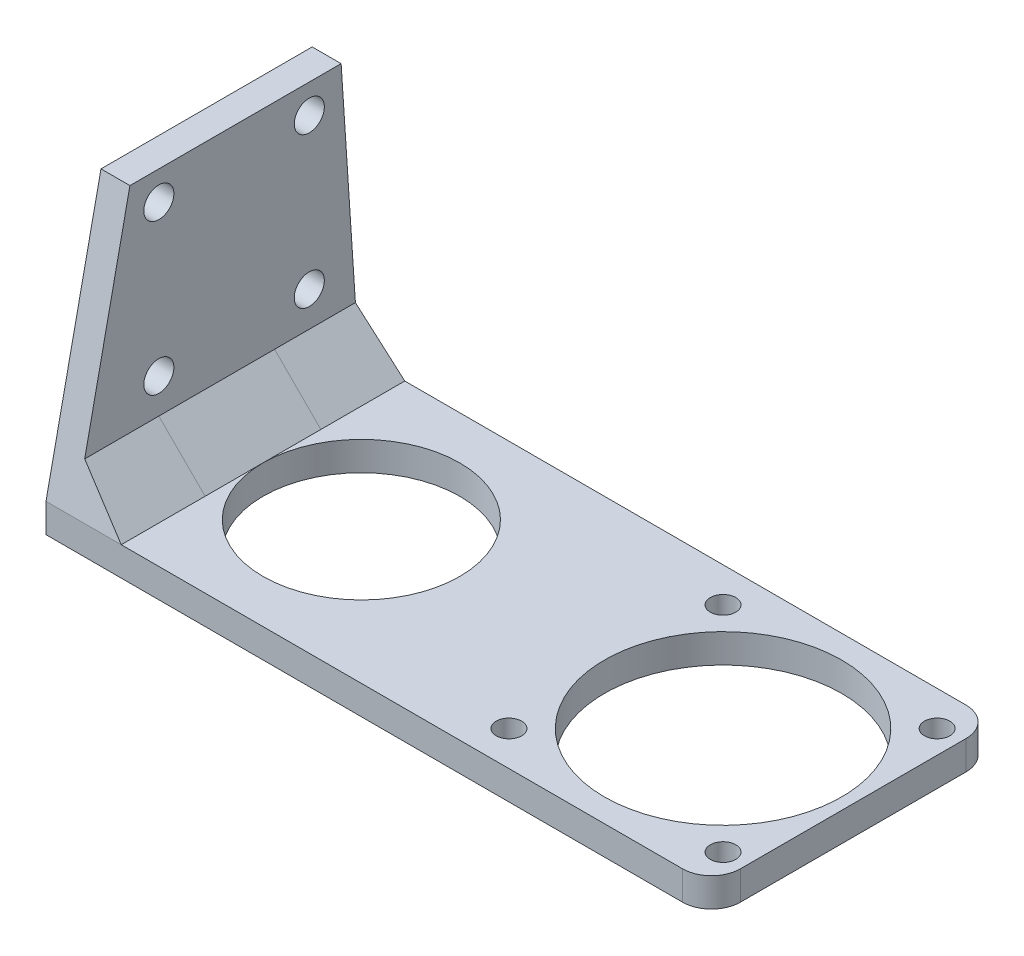
ISO-10303-21;
HEADER;
FILE_DESCRIPTION(('STEP AP214'),'2;1');
FILE_NAME('part.step','',(''),(''),'','','');
FILE_SCHEMA(('AUTOMOTIVE_DESIGN { 1 0 10303 214 1 1 1 1 }'));
ENDSEC;
DATA;
#1=APPLICATION_CONTEXT('core data for automotive mechanical design processes');
#2=APPLICATION_PROTOCOL_DEFINITION('international standard','automotive_design',2000,#1);
#3=PRODUCT_CONTEXT('',#1,'mechanical');
#4=PRODUCT('Part','Part','',(#3));
#5=PRODUCT_RELATED_PRODUCT_CATEGORY('part','',(#4));
#6=PRODUCT_DEFINITION_FORMATION('','',#4);
#7=PRODUCT_DEFINITION_CONTEXT('part definition',#1,'design');
#8=PRODUCT_DEFINITION('design','',#6,#7);
#9=PRODUCT_DEFINITION_SHAPE('','',#8);
#10=(LENGTH_UNIT() NAMED_UNIT(*) SI_UNIT(.MILLI.,.METRE.));
#11=(NAMED_UNIT(*) PLANE_ANGLE_UNIT() SI_UNIT($,.RADIAN.));
#12=(NAMED_UNIT(*) SI_UNIT($,.STERADIAN.) SOLID_ANGLE_UNIT());
#13=UNCERTAINTY_MEASURE_WITH_UNIT(LENGTH_MEASURE(1.E-05),#10,'distance_accuracy_value','');
#14=(GEOMETRIC_REPRESENTATION_CONTEXT(3) GLOBAL_UNCERTAINTY_ASSIGNED_CONTEXT((#13)) GLOBAL_UNIT_ASSIGNED_CONTEXT((#10,
#11,#12)) REPRESENTATION_CONTEXT('',''));
#15=CARTESIAN_POINT('',(0.,0.,0.));
#16=DIRECTION('',(0.,0.,1.));
#17=DIRECTION('',(1.,0.,0.));
#18=AXIS2_PLACEMENT_3D('',#15,#16,#17);
#19=CARTESIAN_POINT('',(-87.5,0.,0.));
#20=DIRECTION('',(-1.,0.,0.));
#21=DIRECTION('',(0.,0.,1.));
#22=AXIS2_PLACEMENT_3D('',#19,#20,#21);
#23=PLANE('',#22);
#24=CARTESIAN_POINT('',(-87.5,45.,-16.));
#25=DIRECTION('',(1.,0.,0.));
#26=DIRECTION('',(0.,0.,-1.));
#27=AXIS2_PLACEMENT_3D('',#24,#25,#26);
#28=CIRCLE('',#27,2.6);
#29=CARTESIAN_POINT('',(-87.5,45.,-18.6));
#30=VERTEX_POINT('',#29);
#31=EDGE_CURVE('E180',#30,#30,#28,.T.);
#32=ORIENTED_EDGE('',*,*,#31,.F.);
#33=EDGE_LOOP('',(#32));
#34=FACE_BOUND('',#33,.T.);
#35=CARTESIAN_POINT('',(-87.5,19.,-16.));
#36=DIRECTION('',(1.,0.,0.));
#37=DIRECTION('',(0.,0.,-1.));
#38=AXIS2_PLACEMENT_3D('',#35,#36,#37);
#39=CIRCLE('',#38,2.6);
#40=CARTESIAN_POINT('',(-87.5,19.,-18.6));
#41=VERTEX_POINT('',#40);
#42=EDGE_CURVE('E174',#41,#41,#39,.T.);
#43=ORIENTED_EDGE('',*,*,#42,.F.);
#44=EDGE_LOOP('',(#43));
#45=FACE_BOUND('',#44,.T.);
#46=CARTESIAN_POINT('',(-87.5,19.,9.99999999999999));
#47=DIRECTION('',(1.,0.,0.));
#48=DIRECTION('',(0.,0.,1.));
#49=AXIS2_PLACEMENT_3D('',#46,#47,#48);
#50=CIRCLE('',#49,2.59999999999999);
#51=CARTESIAN_POINT('',(-87.5,19.,12.6));
#52=VERTEX_POINT('',#51);
#53=EDGE_CURVE('E168',#52,#52,#50,.T.);
#54=ORIENTED_EDGE('',*,*,#53,.F.);
#55=EDGE_LOOP('',(#54));
#56=FACE_BOUND('',#55,.T.);
#57=CARTESIAN_POINT('',(-87.5,45.,10.));
#58=DIRECTION('',(1.,0.,0.));
#59=DIRECTION('',(0.,0.,1.));
#60=AXIS2_PLACEMENT_3D('',#57,#58,#59);
#61=CIRCLE('',#60,2.6);
#62=CARTESIAN_POINT('',(-87.5,45.,12.6));
#63=VERTEX_POINT('',#62);
#64=EDGE_CURVE('E162',#63,#63,#61,.T.);
#65=ORIENTED_EDGE('',*,*,#64,.F.);
#66=EDGE_LOOP('',(#65));
#67=FACE_BOUND('',#66,.T.);
#68=DIRECTION('',(0.,0.,-1.));
#69=VECTOR('',#68,1.);
#70=CARTESIAN_POINT('',(-87.5,13.,10.));
#71=LINE('',#70,#69);
#72=CARTESIAN_POINT('',(-87.5,13.,10.));
#73=VERTEX_POINT('',#72);
#74=CARTESIAN_POINT('',(-87.5,13.,-10.));
#75=VERTEX_POINT('',#74);
#76=EDGE_CURVE('E156',#73,#75,#71,.T.);
#77=ORIENTED_EDGE('',*,*,#76,.T.);
#78=DIRECTION('',(0.,0.,-1.));
#79=VECTOR('',#78,1.);
#80=CARTESIAN_POINT('',(-87.5,13.0000000000001,0.));
#81=LINE('',#80,#79);
#82=CARTESIAN_POINT('',(-87.5,13.0000000000001,-23.9666666666667));
#83=VERTEX_POINT('',#82);
#84=EDGE_CURVE('E153',#75,#83,#81,.T.);
#85=ORIENTED_EDGE('',*,*,#84,.T.);
#86=DIRECTION('',(0.,-0.997785157856609,-0.0665190105237733));
#87=VECTOR('',#86,1.);
#88=CARTESIAN_POINT('',(-87.5,5.,-24.5));
#89=LINE('',#88,#87);
#90=CARTESIAN_POINT('',(-87.5,50.,-21.5));
#91=VERTEX_POINT('',#90);
#92=EDGE_CURVE('E192',#91,#83,#89,.T.);
#93=ORIENTED_EDGE('',*,*,#92,.F.);
#94=DIRECTION('',(0.,0.,-1.));
#95=VECTOR('',#94,1.);
#96=CARTESIAN_POINT('',(-87.5,50.,-21.5));
#97=LINE('',#96,#95);
#98=CARTESIAN_POINT('',(-87.5,50.,15.));
#99=VERTEX_POINT('',#98);
#100=EDGE_CURVE('E188',#99,#91,#97,.T.);
#101=ORIENTED_EDGE('',*,*,#100,.F.);
#102=DIRECTION('',(0.,0.978434284203546,-0.206558348887415));
#103=VECTOR('',#102,1.);
#104=CARTESIAN_POINT('',(-87.5,50.,15.));
#105=LINE('',#104,#103);
#106=CARTESIAN_POINT('',(-87.5,13.0000000000001,22.8111111111111));
#107=VERTEX_POINT('',#106);
#108=EDGE_CURVE('E186',#107,#99,#105,.T.);
#109=ORIENTED_EDGE('',*,*,#108,.F.);
#110=DIRECTION('',(0.,0.,-1.));
#111=VECTOR('',#110,1.);
#112=CARTESIAN_POINT('',(-87.5,13.0000000000001,0.));
#113=LINE('',#112,#111);
#114=EDGE_CURVE('E214',#107,#73,#113,.T.);
#115=ORIENTED_EDGE('',*,*,#114,.T.);
#116=EDGE_LOOP('',(#77,#85,#93,#101,#109,#115));
#117=FACE_BOUND('',#116,.T.);
#118=ADVANCED_FACE('F33',(#34,#45,#56,#67,#117),#23,.F.);
#119=CARTESIAN_POINT('',(-87.5,5.,-24.5));
#120=DIRECTION('',(0.,0.,-1.));
#121=DIRECTION('',(-1.,0.,0.));
#122=AXIS2_PLACEMENT_3D('',#119,#120,#121);
#123=PLANE('',#122);
#124=DIRECTION('',(-1.,0.,0.));
#125=VECTOR('',#124,1.);
#126=CARTESIAN_POINT('',(22.5,5.,-24.5));
#127=LINE('',#126,#125);
#128=CARTESIAN_POINT('',(17.5,5.,-24.5));
#129=VERTEX_POINT('',#128);
#130=CARTESIAN_POINT('',(-79.5,5.,-24.5));
#131=VERTEX_POINT('',#130);
#132=EDGE_CURVE('E134',#129,#131,#127,.T.);
#133=ORIENTED_EDGE('',*,*,#132,.F.);
#134=DIRECTION('',(0.,-1.,0.));
#135=VECTOR('',#134,1.);
#136=CARTESIAN_POINT('',(17.5,0.,-24.5));
#137=LINE('',#136,#135);
#138=CARTESIAN_POINT('',(17.5,0.,-24.5));
#139=VERTEX_POINT('',#138);
#140=EDGE_CURVE('E233',#129,#139,#137,.T.);
#141=ORIENTED_EDGE('',*,*,#140,.T.);
#142=DIRECTION('',(-1.,0.,0.));
#143=VECTOR('',#142,1.);
#144=CARTESIAN_POINT('',(-87.5,0.,-24.5));
#145=LINE('',#144,#143);
#146=CARTESIAN_POINT('',(-92.5,0.,-24.5));
#147=VERTEX_POINT('',#146);
#148=EDGE_CURVE('E195',#139,#147,#145,.T.);
#149=ORIENTED_EDGE('',*,*,#148,.T.);
#150=DIRECTION('',(0.,-1.,0.));
#151=VECTOR('',#150,1.);
#152=CARTESIAN_POINT('',(-92.5,5.,-24.5));
#153=LINE('',#152,#151);
#154=CARTESIAN_POINT('',(-92.5,5.,-24.5));
#155=VERTEX_POINT('',#154);
#156=EDGE_CURVE('E183',#155,#147,#153,.T.);
#157=ORIENTED_EDGE('',*,*,#156,.F.);
#158=DIRECTION('',(-1.,0.,0.));
#159=VECTOR('',#158,1.);
#160=CARTESIAN_POINT('',(-87.5,5.,-24.5));
#161=LINE('',#160,#159);
#162=EDGE_CURVE('E212',#131,#155,#161,.T.);
#163=ORIENTED_EDGE('',*,*,#162,.F.);
#164=EDGE_LOOP('',(#133,#141,#149,#157,#163));
#165=FACE_BOUND('',#164,.T.);
#166=ADVANCED_FACE('F249',(#165),#123,.T.);
#167=CARTESIAN_POINT('',(-87.5,5.,-24.5));
#168=DIRECTION('',(0.,0.0665190105237733,-0.997785157856609));
#169=DIRECTION('',(0.,0.997785157856609,0.0665190105237733));
#170=AXIS2_PLACEMENT_3D('',#167,#168,#169);
#171=PLANE('',#170);
#172=DIRECTION('',(0.,-0.997785157856609,-0.0665190105237733));
#173=VECTOR('',#172,1.);
#174=CARTESIAN_POINT('',(-92.5,5.,-24.5));
#175=LINE('',#174,#173);
#176=CARTESIAN_POINT('',(-92.5,50.,-21.5));
#177=VERTEX_POINT('',#176);
#178=EDGE_CURVE('E189',#177,#155,#175,.T.);
#179=ORIENTED_EDGE('',*,*,#178,.F.);
#180=DIRECTION('',(-1.,0.,0.));
#181=VECTOR('',#180,1.);
#182=CARTESIAN_POINT('',(-87.5,50.,-21.5));
#183=LINE('',#182,#181);
#184=EDGE_CURVE('E215',#91,#177,#183,.T.);
#185=ORIENTED_EDGE('',*,*,#184,.F.);
#186=ORIENTED_EDGE('',*,*,#92,.T.);
#187=DIRECTION('',(0.706322414022014,-0.70632241402202,-0.0470881609348009));
#188=VECTOR('',#187,1.);
#189=CARTESIAN_POINT('',(-88.2971175166297,13.7971175166298,-23.9135254988913));
#190=LINE('',#189,#188);
#191=EDGE_CURVE('E138',#83,#131,#190,.T.);
#192=ORIENTED_EDGE('',*,*,#191,.T.);
#193=ORIENTED_EDGE('',*,*,#162,.T.);
#194=EDGE_LOOP('',(#179,#185,#186,#192,#193));
#195=FACE_BOUND('',#194,.T.);
#196=ADVANCED_FACE('F325',(#195),#171,.T.);
#197=CARTESIAN_POINT('',(-87.5,50.,-21.5));
#198=DIRECTION('',(0.,1.,0.));
#199=DIRECTION('',(0.,0.,1.));
#200=AXIS2_PLACEMENT_3D('',#197,#198,#199);
#201=PLANE('',#200);
#202=DIRECTION('',(0.,0.,-1.));
#203=VECTOR('',#202,1.);
#204=CARTESIAN_POINT('',(-92.5,50.,-21.5));
#205=LINE('',#204,#203);
#206=CARTESIAN_POINT('',(-92.5,50.,15.));
#207=VERTEX_POINT('',#206);
#208=EDGE_CURVE('E207',#207,#177,#205,.T.);
#209=ORIENTED_EDGE('',*,*,#208,.F.);
#210=DIRECTION('',(-1.,0.,0.));
#211=VECTOR('',#210,1.);
#212=CARTESIAN_POINT('',(-87.5,50.,15.));
#213=LINE('',#212,#211);
#214=EDGE_CURVE('E217',#99,#207,#213,.T.);
#215=ORIENTED_EDGE('',*,*,#214,.F.);
#216=ORIENTED_EDGE('',*,*,#100,.T.);
#217=ORIENTED_EDGE('',*,*,#184,.T.);
#218=EDGE_LOOP('',(#209,#215,#216,#217));
#219=FACE_BOUND('',#218,.T.);
#220=ADVANCED_FACE('F339',(#219),#201,.T.);
#221=CARTESIAN_POINT('',(-87.5,50.,15.));
#222=DIRECTION('',(0.,0.206558348887415,0.978434284203546));
#223=DIRECTION('',(0.,-0.978434284203546,0.206558348887415));
#224=AXIS2_PLACEMENT_3D('',#221,#222,#223);
#225=PLANE('',#224);
#226=DIRECTION('',(0.,0.978434284203546,-0.206558348887415));
#227=VECTOR('',#226,1.);
#228=CARTESIAN_POINT('',(-92.5,50.,15.));
#229=LINE('',#228,#227);
#230=CARTESIAN_POINT('',(-92.5,5.,24.5));
#231=VERTEX_POINT('',#230);
#232=EDGE_CURVE('E204',#231,#207,#229,.T.);
#233=ORIENTED_EDGE('',*,*,#232,.F.);
#234=DIRECTION('',(-1.,0.,0.));
#235=VECTOR('',#234,1.);
#236=CARTESIAN_POINT('',(-87.5,5.,24.5));
#237=LINE('',#236,#235);
#238=CARTESIAN_POINT('',(-79.5,5.,24.5));
#239=VERTEX_POINT('',#238);
#240=EDGE_CURVE('E219',#239,#231,#237,.T.);
#241=ORIENTED_EDGE('',*,*,#240,.F.);
#242=DIRECTION('',(-0.699357490632738,0.699357490632744,-0.147642136911357));
#243=VECTOR('',#242,1.);
#244=CARTESIAN_POINT('',(-89.8553529376245,15.3553529376246,22.3138699353903));
#245=LINE('',#244,#243);
#246=EDGE_CURVE('E231',#239,#107,#245,.T.);
#247=ORIENTED_EDGE('',*,*,#246,.T.);
#248=ORIENTED_EDGE('',*,*,#108,.T.);
#249=ORIENTED_EDGE('',*,*,#214,.T.);
#250=EDGE_LOOP('',(#233,#241,#247,#248,#249));
#251=FACE_BOUND('',#250,.T.);
#252=ADVANCED_FACE('F343',(#251),#225,.T.);
#253=CARTESIAN_POINT('',(-87.5,0.,24.5));
#254=DIRECTION('',(0.,0.,1.));
#255=DIRECTION('',(1.,0.,0.));
#256=AXIS2_PLACEMENT_3D('',#253,#254,#255);
#257=PLANE('',#256);
#258=DIRECTION('',(-1.,0.,0.));
#259=VECTOR('',#258,1.);
#260=CARTESIAN_POINT('',(-87.5,0.,24.5));
#261=LINE('',#260,#259);
#262=CARTESIAN_POINT('',(17.5,0.,24.5));
#263=VERTEX_POINT('',#262);
#264=CARTESIAN_POINT('',(-92.5,0.,24.5));
#265=VERTEX_POINT('',#264);
#266=EDGE_CURVE('E221',#263,#265,#261,.T.);
#267=ORIENTED_EDGE('',*,*,#266,.F.);
#268=DIRECTION('',(0.,-1.,0.));
#269=VECTOR('',#268,1.);
#270=CARTESIAN_POINT('',(17.5,5.,24.5));
#271=LINE('',#270,#269);
#272=CARTESIAN_POINT('',(17.5,5.,24.5));
#273=VERTEX_POINT('',#272);
#274=EDGE_CURVE('E11',#263,#273,#271,.F.);
#275=ORIENTED_EDGE('',*,*,#274,.T.);
#276=DIRECTION('',(1.,0.,0.));
#277=VECTOR('',#276,1.);
#278=CARTESIAN_POINT('',(-92.5,5.,24.5));
#279=LINE('',#278,#277);
#280=EDGE_CURVE('E252',#239,#273,#279,.T.);
#281=ORIENTED_EDGE('',*,*,#280,.F.);
#282=ORIENTED_EDGE('',*,*,#240,.T.);
#283=DIRECTION('',(0.,1.,0.));
#284=VECTOR('',#283,1.);
#285=CARTESIAN_POINT('',(-92.5,0.,24.5));
#286=LINE('',#285,#284);
#287=EDGE_CURVE('E201',#265,#231,#286,.T.);
#288=ORIENTED_EDGE('',*,*,#287,.F.);
#289=EDGE_LOOP('',(#267,#275,#281,#282,#288));
#290=FACE_BOUND('',#289,.T.);
#291=ADVANCED_FACE('F347',(#290),#257,.T.);
#292=CARTESIAN_POINT('',(-87.5,0.,-24.5));
#293=DIRECTION('',(0.,-1.,0.));
#294=DIRECTION('',(0.,0.,-1.));
#295=AXIS2_PLACEMENT_3D('',#292,#293,#294);
#296=PLANE('',#295);
#297=ORIENTED_EDGE('',*,*,#148,.F.);
#298=CARTESIAN_POINT('',(17.5,0.,-19.5));
#299=DIRECTION('',(0.,-1.,0.));
#300=DIRECTION('',(0.,0.,-1.));
#301=AXIS2_PLACEMENT_3D('',#298,#299,#300);
#302=CIRCLE('',#301,5.);
#303=CARTESIAN_POINT('',(22.5,0.,-19.5));
#304=VERTEX_POINT('',#303);
#305=EDGE_CURVE('E238',#139,#304,#302,.T.);
#306=ORIENTED_EDGE('',*,*,#305,.T.);
#307=DIRECTION('',(0.,0.,-1.));
#308=VECTOR('',#307,1.);
#309=CARTESIAN_POINT('',(22.5,0.,-22.5));
#310=LINE('',#309,#308);
#311=CARTESIAN_POINT('',(22.5,0.,19.5));
#312=VERTEX_POINT('',#311);
#313=EDGE_CURVE('E260',#312,#304,#310,.T.);
#314=ORIENTED_EDGE('',*,*,#313,.F.);
#315=CARTESIAN_POINT('',(17.5,0.,19.5));
#316=DIRECTION('',(0.,-1.,0.));
#317=DIRECTION('',(0.,0.,-1.));
#318=AXIS2_PLACEMENT_3D('',#315,#316,#317);
#319=CIRCLE('',#318,5.);
#320=EDGE_CURVE('E236',#312,#263,#319,.T.);
#321=ORIENTED_EDGE('',*,*,#320,.T.);
#322=ORIENTED_EDGE('',*,*,#266,.T.);
#323=DIRECTION('',(0.,0.,1.));
#324=VECTOR('',#323,1.);
#325=CARTESIAN_POINT('',(-92.5,0.,-24.5));
#326=LINE('',#325,#324);
#327=EDGE_CURVE('E198',#147,#265,#326,.T.);
#328=ORIENTED_EDGE('',*,*,#327,.F.);
#329=EDGE_LOOP('',(#297,#306,#314,#321,#322,#328));
#330=FACE_BOUND('',#329,.T.);
#331=CARTESIAN_POINT('',(-62.5,0.,0.));
#332=DIRECTION('',(0.,1.,0.));
#333=DIRECTION('',(0.,0.,1.));
#334=AXIS2_PLACEMENT_3D('',#331,#332,#333);
#335=CIRCLE('',#334,17.);
#336=CARTESIAN_POINT('',(-62.5,0.,17.));
#337=VERTEX_POINT('',#336);
#338=EDGE_CURVE('E299',#337,#337,#335,.T.);
#339=ORIENTED_EDGE('',*,*,#338,.T.);
#340=EDGE_LOOP('',(#339));
#341=FACE_BOUND('',#340,.T.);
#342=CARTESIAN_POINT('',(-18.5,0.,18.5));
#343=DIRECTION('',(0.,1.,0.));
#344=DIRECTION('',(0.,0.,-1.));
#345=AXIS2_PLACEMENT_3D('',#342,#343,#344);
#346=CIRCLE('',#345,2.2);
#347=CARTESIAN_POINT('',(-18.5,0.,16.3));
#348=VERTEX_POINT('',#347);
#349=EDGE_CURVE('E294',#348,#348,#346,.T.);
#350=ORIENTED_EDGE('',*,*,#349,.T.);
#351=EDGE_LOOP('',(#350));
#352=FACE_BOUND('',#351,.T.);
#353=CARTESIAN_POINT('',(18.5,0.,18.5));
#354=DIRECTION('',(0.,1.,0.));
#355=DIRECTION('',(0.,0.,1.));
#356=AXIS2_PLACEMENT_3D('',#353,#354,#355);
#357=CIRCLE('',#356,2.2);
#358=CARTESIAN_POINT('',(18.5,0.,20.7));
#359=VERTEX_POINT('',#358);
#360=EDGE_CURVE('E288',#359,#359,#357,.T.);
#361=ORIENTED_EDGE('',*,*,#360,.T.);
#362=EDGE_LOOP('',(#361));
#363=FACE_BOUND('',#362,.T.);
#364=CARTESIAN_POINT('',(-18.5,0.,-18.5));
#365=DIRECTION('',(0.,1.,0.));
#366=DIRECTION('',(0.,0.,1.));
#367=AXIS2_PLACEMENT_3D('',#364,#365,#366);
#368=CIRCLE('',#367,2.2);
#369=CARTESIAN_POINT('',(-18.5,0.,-16.3));
#370=VERTEX_POINT('',#369);
#371=EDGE_CURVE('E282',#370,#370,#368,.T.);
#372=ORIENTED_EDGE('',*,*,#371,.T.);
#373=EDGE_LOOP('',(#372));
#374=FACE_BOUND('',#373,.T.);
#375=CARTESIAN_POINT('',(18.5,0.,-18.5));
#376=DIRECTION('',(0.,1.,0.));
#377=DIRECTION('',(0.,0.,-1.));
#378=AXIS2_PLACEMENT_3D('',#375,#376,#377);
#379=CIRCLE('',#378,2.2);
#380=CARTESIAN_POINT('',(18.5,0.,-20.7));
#381=VERTEX_POINT('',#380);
#382=EDGE_CURVE('E276',#381,#381,#379,.T.);
#383=ORIENTED_EDGE('',*,*,#382,.T.);
#384=EDGE_LOOP('',(#383));
#385=FACE_BOUND('',#384,.T.);
#386=CARTESIAN_POINT('',(0.,0.,0.));
#387=DIRECTION('',(0.,1.,0.));
#388=DIRECTION('',(0.,0.,1.));
#389=AXIS2_PLACEMENT_3D('',#386,#387,#388);
#390=CIRCLE('',#389,20.5);
#391=CARTESIAN_POINT('',(0.,0.,20.5));
#392=VERTEX_POINT('',#391);
#393=EDGE_CURVE('E268',#392,#392,#390,.T.);
#394=ORIENTED_EDGE('',*,*,#393,.T.);
#395=EDGE_LOOP('',(#394));
#396=FACE_BOUND('',#395,.T.);
#397=ADVANCED_FACE('F258',(#330,#341,#352,#363,#374,#385,#396),#296,.T.);
#398=CARTESIAN_POINT('',(-92.5,0.,0.));
#399=DIRECTION('',(-1.,0.,0.));
#400=DIRECTION('',(0.,0.,1.));
#401=AXIS2_PLACEMENT_3D('',#398,#399,#400);
#402=PLANE('',#401);
#403=ORIENTED_EDGE('',*,*,#178,.T.);
#404=ORIENTED_EDGE('',*,*,#156,.T.);
#405=ORIENTED_EDGE('',*,*,#327,.T.);
#406=ORIENTED_EDGE('',*,*,#287,.T.);
#407=ORIENTED_EDGE('',*,*,#232,.T.);
#408=ORIENTED_EDGE('',*,*,#208,.T.);
#409=EDGE_LOOP('',(#403,#404,#405,#406,#407,#408));
#410=FACE_BOUND('',#409,.T.);
#411=CARTESIAN_POINT('',(-92.5,45.,10.));
#412=DIRECTION('',(-1.,0.,0.));
#413=DIRECTION('',(0.,0.,1.));
#414=AXIS2_PLACEMENT_3D('',#411,#412,#413);
#415=CIRCLE('',#414,2.6);
#416=CARTESIAN_POINT('',(-92.5,45.,12.6));
#417=VERTEX_POINT('',#416);
#418=EDGE_CURVE('E161',#417,#417,#415,.F.);
#419=ORIENTED_EDGE('',*,*,#418,.T.);
#420=EDGE_LOOP('',(#419));
#421=FACE_BOUND('',#420,.T.);
#422=CARTESIAN_POINT('',(-92.5,19.,9.99999999999999));
#423=DIRECTION('',(-1.,0.,0.));
#424=DIRECTION('',(0.,0.,1.));
#425=AXIS2_PLACEMENT_3D('',#422,#423,#424);
#426=CIRCLE('',#425,2.59999999999999);
#427=CARTESIAN_POINT('',(-92.5,19.,12.6));
#428=VERTEX_POINT('',#427);
#429=EDGE_CURVE('E165',#428,#428,#426,.F.);
#430=ORIENTED_EDGE('',*,*,#429,.T.);
#431=EDGE_LOOP('',(#430));
#432=FACE_BOUND('',#431,.T.);
#433=CARTESIAN_POINT('',(-92.5,19.,-16.));
#434=DIRECTION('',(-1.,0.,0.));
#435=DIRECTION('',(0.,0.,1.));
#436=AXIS2_PLACEMENT_3D('',#433,#434,#435);
#437=CIRCLE('',#436,2.6);
#438=CARTESIAN_POINT('',(-92.5,19.,-13.4));
#439=VERTEX_POINT('',#438);
#440=EDGE_CURVE('E171',#439,#439,#437,.F.);
#441=ORIENTED_EDGE('',*,*,#440,.T.);
#442=EDGE_LOOP('',(#441));
#443=FACE_BOUND('',#442,.T.);
#444=CARTESIAN_POINT('',(-92.5,45.,-16.));
#445=DIRECTION('',(-1.,0.,0.));
#446=DIRECTION('',(0.,0.,1.));
#447=AXIS2_PLACEMENT_3D('',#444,#445,#446);
#448=CIRCLE('',#447,2.6);
#449=CARTESIAN_POINT('',(-92.5,45.,-13.4));
#450=VERTEX_POINT('',#449);
#451=EDGE_CURVE('E177',#450,#450,#448,.F.);
#452=ORIENTED_EDGE('',*,*,#451,.T.);
#453=EDGE_LOOP('',(#452));
#454=FACE_BOUND('',#453,.T.);
#455=ADVANCED_FACE('F333',(#410,#421,#432,#443,#454),#402,.T.);
#456=CARTESIAN_POINT('',(-92.501,45.,-16.));
#457=DIRECTION('',(1.,0.,0.));
#458=DIRECTION('',(0.,0.,-1.));
#459=AXIS2_PLACEMENT_3D('',#456,#457,#458);
#460=CYLINDRICAL_SURFACE('',#459,2.6);
#461=ORIENTED_EDGE('',*,*,#451,.F.);
#462=EDGE_LOOP('',(#461));
#463=FACE_BOUND('',#462,.T.);
#464=ORIENTED_EDGE('',*,*,#31,.T.);
#465=EDGE_LOOP('',(#464));
#466=FACE_BOUND('',#465,.T.);
#467=ADVANCED_FACE('F331',(#463,#466),#460,.F.);
#468=CARTESIAN_POINT('',(-92.501,19.,-16.));
#469=DIRECTION('',(1.,0.,0.));
#470=DIRECTION('',(0.,0.,-1.));
#471=AXIS2_PLACEMENT_3D('',#468,#469,#470);
#472=CYLINDRICAL_SURFACE('',#471,2.6);
#473=ORIENTED_EDGE('',*,*,#440,.F.);
#474=EDGE_LOOP('',(#473));
#475=FACE_BOUND('',#474,.T.);
#476=ORIENTED_EDGE('',*,*,#42,.T.);
#477=EDGE_LOOP('',(#476));
#478=FACE_BOUND('',#477,.T.);
#479=ADVANCED_FACE('F386',(#475,#478),#472,.F.);
#480=CARTESIAN_POINT('',(-92.501,19.,9.99999999999999));
#481=DIRECTION('',(1.,0.,0.));
#482=DIRECTION('',(0.,0.,-1.));
#483=AXIS2_PLACEMENT_3D('',#480,#481,#482);
#484=CYLINDRICAL_SURFACE('',#483,2.59999999999999);
#485=ORIENTED_EDGE('',*,*,#429,.F.);
#486=EDGE_LOOP('',(#485));
#487=FACE_BOUND('',#486,.T.);
#488=ORIENTED_EDGE('',*,*,#53,.T.);
#489=EDGE_LOOP('',(#488));
#490=FACE_BOUND('',#489,.T.);
#491=ADVANCED_FACE('F390',(#487,#490),#484,.F.);
#492=CARTESIAN_POINT('',(-92.501,45.,10.));
#493=DIRECTION('',(1.,0.,0.));
#494=DIRECTION('',(0.,0.,-1.));
#495=AXIS2_PLACEMENT_3D('',#492,#493,#494);
#496=CYLINDRICAL_SURFACE('',#495,2.6);
#497=ORIENTED_EDGE('',*,*,#418,.F.);
#498=EDGE_LOOP('',(#497));
#499=FACE_BOUND('',#498,.T.);
#500=ORIENTED_EDGE('',*,*,#64,.T.);
#501=EDGE_LOOP('',(#500));
#502=FACE_BOUND('',#501,.T.);
#503=ADVANCED_FACE('F395',(#499,#502),#496,.F.);
#504=CARTESIAN_POINT('',(-87.5,13.,10.));
#505=DIRECTION('',(-0.707106781186547,-0.707106781186548,0.));
#506=DIRECTION('',(0.707106781186548,-0.707106781186547,0.));
#507=AXIS2_PLACEMENT_3D('',#504,#505,#506);
#508=PLANE('',#507);
#509=DIRECTION('',(-0.707106781186548,0.707106781186547,0.));
#510=VECTOR('',#509,1.);
#511=CARTESIAN_POINT('',(-87.5,13.,-10.));
#512=LINE('',#511,#510);
#513=CARTESIAN_POINT('',(-79.5,5.,-10.));
#514=VERTEX_POINT('',#513);
#515=EDGE_CURVE('E144',#514,#75,#512,.T.);
#516=ORIENTED_EDGE('',*,*,#515,.T.);
#517=ORIENTED_EDGE('',*,*,#76,.F.);
#518=DIRECTION('',(-0.707106781186548,0.707106781186547,0.));
#519=VECTOR('',#518,1.);
#520=CARTESIAN_POINT('',(-87.5,13.,10.));
#521=LINE('',#520,#519);
#522=CARTESIAN_POINT('',(-79.5,5.,10.));
#523=VERTEX_POINT('',#522);
#524=EDGE_CURVE('E154',#523,#73,#521,.T.);
#525=ORIENTED_EDGE('',*,*,#524,.F.);
#526=DIRECTION('',(0.,0.,-1.));
#527=VECTOR('',#526,1.);
#528=CARTESIAN_POINT('',(-79.5,5.,10.));
#529=LINE('',#528,#527);
#530=CARTESIAN_POINT('',(-79.5,5.00000000000001,0.));
#531=VERTEX_POINT('',#530);
#532=EDGE_CURVE('E147',#523,#531,#529,.T.);
#533=ORIENTED_EDGE('',*,*,#532,.T.);
#534=DIRECTION('',(0.,0.,-1.));
#535=VECTOR('',#534,1.);
#536=CARTESIAN_POINT('',(-79.5,5.,10.));
#537=LINE('',#536,#535);
#538=EDGE_CURVE('E131',#531,#514,#537,.T.);
#539=ORIENTED_EDGE('',*,*,#538,.T.);
#540=EDGE_LOOP('',(#516,#517,#525,#533,#539));
#541=FACE_BOUND('',#540,.T.);
#542=ADVANCED_FACE('F142',(#541),#508,.F.);
#543=CARTESIAN_POINT('',(0.,5.,0.));
#544=DIRECTION('',(0.,1.,0.));
#545=DIRECTION('',(0.,0.,1.));
#546=AXIS2_PLACEMENT_3D('',#543,#544,#545);
#547=PLANE('',#546);
#548=CARTESIAN_POINT('',(0.,5.,0.));
#549=DIRECTION('',(0.,1.,0.));
#550=DIRECTION('',(0.,0.,1.));
#551=AXIS2_PLACEMENT_3D('',#548,#549,#550);
#552=CIRCLE('',#551,20.5);
#553=CARTESIAN_POINT('',(0.,5.,20.5));
#554=VERTEX_POINT('',#553);
#555=EDGE_CURVE('E264',#554,#554,#552,.T.);
#556=ORIENTED_EDGE('',*,*,#555,.F.);
#557=EDGE_LOOP('',(#556));
#558=FACE_BOUND('',#557,.T.);
#559=CARTESIAN_POINT('',(18.5,5.,-18.5));
#560=DIRECTION('',(0.,1.,0.));
#561=DIRECTION('',(0.,0.,1.));
#562=AXIS2_PLACEMENT_3D('',#559,#560,#561);
#563=CIRCLE('',#562,2.2);
#564=CARTESIAN_POINT('',(18.5,5.,-16.3));
#565=VERTEX_POINT('',#564);
#566=EDGE_CURVE('E272',#565,#565,#563,.T.);
#567=ORIENTED_EDGE('',*,*,#566,.F.);
#568=EDGE_LOOP('',(#567));
#569=FACE_BOUND('',#568,.T.);
#570=CARTESIAN_POINT('',(-18.5,5.,-18.5));
#571=DIRECTION('',(0.,1.,0.));
#572=DIRECTION('',(0.,0.,1.));
#573=AXIS2_PLACEMENT_3D('',#570,#571,#572);
#574=CIRCLE('',#573,2.2);
#575=CARTESIAN_POINT('',(-18.5,5.,-16.3));
#576=VERTEX_POINT('',#575);
#577=EDGE_CURVE('E279',#576,#576,#574,.T.);
#578=ORIENTED_EDGE('',*,*,#577,.F.);
#579=EDGE_LOOP('',(#578));
#580=FACE_BOUND('',#579,.T.);
#581=CARTESIAN_POINT('',(18.5,5.,18.5));
#582=DIRECTION('',(0.,1.,0.));
#583=DIRECTION('',(0.,0.,1.));
#584=AXIS2_PLACEMENT_3D('',#581,#582,#583);
#585=CIRCLE('',#584,2.2);
#586=CARTESIAN_POINT('',(18.5,5.,20.7));
#587=VERTEX_POINT('',#586);
#588=EDGE_CURVE('E285',#587,#587,#585,.T.);
#589=ORIENTED_EDGE('',*,*,#588,.F.);
#590=EDGE_LOOP('',(#589));
#591=FACE_BOUND('',#590,.T.);
#592=CARTESIAN_POINT('',(-18.5,5.,18.5));
#593=DIRECTION('',(0.,1.,0.));
#594=DIRECTION('',(0.,0.,1.));
#595=AXIS2_PLACEMENT_3D('',#592,#593,#594);
#596=CIRCLE('',#595,2.2);
#597=CARTESIAN_POINT('',(-18.5,5.,20.7));
#598=VERTEX_POINT('',#597);
#599=EDGE_CURVE('E291',#598,#598,#596,.T.);
#600=ORIENTED_EDGE('',*,*,#599,.F.);
#601=EDGE_LOOP('',(#600));
#602=FACE_BOUND('',#601,.T.);
#603=DIRECTION('',(0.,0.,-1.));
#604=VECTOR('',#603,1.);
#605=CARTESIAN_POINT('',(22.5,5.,-22.5));
#606=LINE('',#605,#604);
#607=CARTESIAN_POINT('',(22.5,5.,19.5));
#608=VERTEX_POINT('',#607);
#609=CARTESIAN_POINT('',(22.5,5.,-19.5));
#610=VERTEX_POINT('',#609);
#611=EDGE_CURVE('E148',#608,#610,#606,.T.);
#612=ORIENTED_EDGE('',*,*,#611,.T.);
#613=CARTESIAN_POINT('',(17.5,5.,-19.5));
#614=DIRECTION('',(0.,1.,0.));
#615=DIRECTION('',(0.,0.,1.));
#616=AXIS2_PLACEMENT_3D('',#613,#614,#615);
#617=CIRCLE('',#616,5.);
#618=EDGE_CURVE('E41',#610,#129,#617,.T.);
#619=ORIENTED_EDGE('',*,*,#618,.T.);
#620=ORIENTED_EDGE('',*,*,#132,.T.);
#621=DIRECTION('',(0.,0.,1.));
#622=VECTOR('',#621,1.);
#623=CARTESIAN_POINT('',(-79.5,5.,0.));
#624=LINE('',#623,#622);
#625=EDGE_CURVE('E127',#131,#514,#624,.T.);
#626=ORIENTED_EDGE('',*,*,#625,.T.);
#627=ORIENTED_EDGE('',*,*,#538,.F.);
#628=CARTESIAN_POINT('',(-62.5,5.,0.));
#629=DIRECTION('',(0.,1.,0.));
#630=DIRECTION('',(0.,0.,1.));
#631=AXIS2_PLACEMENT_3D('',#628,#629,#630);
#632=CIRCLE('',#631,17.);
#633=EDGE_CURVE('E253',#531,#531,#632,.T.);
#634=ORIENTED_EDGE('',*,*,#633,.F.);
#635=ORIENTED_EDGE('',*,*,#532,.F.);
#636=DIRECTION('',(0.,0.,1.));
#637=VECTOR('',#636,1.);
#638=CARTESIAN_POINT('',(-79.5,5.,0.));
#639=LINE('',#638,#637);
#640=EDGE_CURVE('E139',#523,#239,#639,.T.);
#641=ORIENTED_EDGE('',*,*,#640,.T.);
#642=ORIENTED_EDGE('',*,*,#280,.T.);
#643=CARTESIAN_POINT('',(17.5,5.,19.5));
#644=DIRECTION('',(0.,1.,0.));
#645=DIRECTION('',(0.,0.,1.));
#646=AXIS2_PLACEMENT_3D('',#643,#644,#645);
#647=CIRCLE('',#646,5.);
#648=EDGE_CURVE('E244',#273,#608,#647,.T.);
#649=ORIENTED_EDGE('',*,*,#648,.T.);
#650=EDGE_LOOP('',(#612,#619,#620,#626,#627,#634,#635,#641,#642,#649));
#651=FACE_BOUND('',#650,.T.);
#652=ADVANCED_FACE('F129',(#558,#569,#580,#591,#602,#651),#547,.T.);
#653=CARTESIAN_POINT('',(22.5,5.,-22.5));
#654=DIRECTION('',(-1.,0.,0.));
#655=DIRECTION('',(0.,0.,1.));
#656=AXIS2_PLACEMENT_3D('',#653,#654,#655);
#657=PLANE('',#656);
#658=ORIENTED_EDGE('',*,*,#313,.T.);
#659=DIRECTION('',(0.,-1.,0.));
#660=VECTOR('',#659,1.);
#661=CARTESIAN_POINT('',(22.5,5.,-19.5));
#662=LINE('',#661,#660);
#663=EDGE_CURVE('E54',#304,#610,#662,.F.);
#664=ORIENTED_EDGE('',*,*,#663,.T.);
#665=ORIENTED_EDGE('',*,*,#611,.F.);
#666=DIRECTION('',(0.,-1.,0.));
#667=VECTOR('',#666,1.);
#668=CARTESIAN_POINT('',(22.5,0.,19.5));
#669=LINE('',#668,#667);
#670=EDGE_CURVE('E240',#608,#312,#669,.T.);
#671=ORIENTED_EDGE('',*,*,#670,.T.);
#672=EDGE_LOOP('',(#658,#664,#665,#671));
#673=FACE_BOUND('',#672,.T.);
#674=ADVANCED_FACE('F262',(#673),#657,.F.);
#675=CARTESIAN_POINT('',(0.,5.,0.));
#676=DIRECTION('',(0.,-1.,0.));
#677=DIRECTION('',(0.,0.,-1.));
#678=AXIS2_PLACEMENT_3D('',#675,#676,#677);
#679=CYLINDRICAL_SURFACE('',#678,20.5);
#680=ORIENTED_EDGE('',*,*,#555,.T.);
#681=EDGE_LOOP('',(#680));
#682=FACE_BOUND('',#681,.T.);
#683=ORIENTED_EDGE('',*,*,#393,.F.);
#684=EDGE_LOOP('',(#683));
#685=FACE_BOUND('',#684,.T.);
#686=ADVANCED_FACE('F407',(#682,#685),#679,.F.);
#687=CARTESIAN_POINT('',(18.5,5.001,-18.5));
#688=DIRECTION('',(0.,-1.,0.));
#689=DIRECTION('',(0.,0.,-1.));
#690=AXIS2_PLACEMENT_3D('',#687,#688,#689);
#691=CYLINDRICAL_SURFACE('',#690,2.2);
#692=ORIENTED_EDGE('',*,*,#566,.T.);
#693=EDGE_LOOP('',(#692));
#694=FACE_BOUND('',#693,.T.);
#695=ORIENTED_EDGE('',*,*,#382,.F.);
#696=EDGE_LOOP('',(#695));
#697=FACE_BOUND('',#696,.T.);
#698=ADVANCED_FACE('F413',(#694,#697),#691,.F.);
#699=CARTESIAN_POINT('',(-18.5,5.001,-18.5));
#700=DIRECTION('',(0.,-1.,0.));
#701=DIRECTION('',(0.,0.,-1.));
#702=AXIS2_PLACEMENT_3D('',#699,#700,#701);
#703=CYLINDRICAL_SURFACE('',#702,2.2);
#704=ORIENTED_EDGE('',*,*,#577,.T.);
#705=EDGE_LOOP('',(#704));
#706=FACE_BOUND('',#705,.T.);
#707=ORIENTED_EDGE('',*,*,#371,.F.);
#708=EDGE_LOOP('',(#707));
#709=FACE_BOUND('',#708,.T.);
#710=ADVANCED_FACE('F417',(#706,#709),#703,.F.);
#711=CARTESIAN_POINT('',(18.5,5.001,18.5));
#712=DIRECTION('',(0.,-1.,0.));
#713=DIRECTION('',(0.,0.,-1.));
#714=AXIS2_PLACEMENT_3D('',#711,#712,#713);
#715=CYLINDRICAL_SURFACE('',#714,2.2);
#716=ORIENTED_EDGE('',*,*,#588,.T.);
#717=EDGE_LOOP('',(#716));
#718=FACE_BOUND('',#717,.T.);
#719=ORIENTED_EDGE('',*,*,#360,.F.);
#720=EDGE_LOOP('',(#719));
#721=FACE_BOUND('',#720,.T.);
#722=ADVANCED_FACE('F315',(#718,#721),#715,.F.);
#723=CARTESIAN_POINT('',(-18.5,5.001,18.5));
#724=DIRECTION('',(0.,-1.,0.));
#725=DIRECTION('',(0.,0.,-1.));
#726=AXIS2_PLACEMENT_3D('',#723,#724,#725);
#727=CYLINDRICAL_SURFACE('',#726,2.2);
#728=ORIENTED_EDGE('',*,*,#599,.T.);
#729=EDGE_LOOP('',(#728));
#730=FACE_BOUND('',#729,.T.);
#731=ORIENTED_EDGE('',*,*,#349,.F.);
#732=EDGE_LOOP('',(#731));
#733=FACE_BOUND('',#732,.T.);
#734=ADVANCED_FACE('F306',(#730,#733),#727,.F.);
#735=CARTESIAN_POINT('',(-62.5,50.001,0.));
#736=DIRECTION('',(0.,-1.,0.));
#737=DIRECTION('',(0.,0.,-1.));
#738=AXIS2_PLACEMENT_3D('',#735,#736,#737);
#739=CYLINDRICAL_SURFACE('',#738,17.);
#740=ORIENTED_EDGE('',*,*,#633,.T.);
#741=EDGE_LOOP('',(#740));
#742=FACE_BOUND('',#741,.T.);
#743=ORIENTED_EDGE('',*,*,#338,.F.);
#744=EDGE_LOOP('',(#743));
#745=FACE_BOUND('',#744,.T.);
#746=ADVANCED_FACE('F304',(#742,#745),#739,.F.);
#747=CARTESIAN_POINT('',(-87.5,13.0000000000001,0.));
#748=DIRECTION('',(-0.707106781186551,-0.707106781186544,0.));
#749=DIRECTION('',(0.,0.,-1.));
#750=AXIS2_PLACEMENT_3D('',#747,#748,#749);
#751=PLANE('',#750);
#752=ORIENTED_EDGE('',*,*,#515,.F.);
#753=ORIENTED_EDGE('',*,*,#625,.F.);
#754=ORIENTED_EDGE('',*,*,#191,.F.);
#755=ORIENTED_EDGE('',*,*,#84,.F.);
#756=EDGE_LOOP('',(#752,#753,#754,#755));
#757=FACE_BOUND('',#756,.T.);
#758=ADVANCED_FACE('F151',(#757),#751,.F.);
#759=CARTESIAN_POINT('',(-87.5,13.0000000000001,0.));
#760=DIRECTION('',(-0.707106781186551,-0.707106781186544,0.));
#761=DIRECTION('',(0.,0.,-1.));
#762=AXIS2_PLACEMENT_3D('',#759,#760,#761);
#763=PLANE('',#762);
#764=ORIENTED_EDGE('',*,*,#246,.F.);
#765=ORIENTED_EDGE('',*,*,#640,.F.);
#766=ORIENTED_EDGE('',*,*,#524,.T.);
#767=ORIENTED_EDGE('',*,*,#114,.F.);
#768=EDGE_LOOP('',(#764,#765,#766,#767));
#769=FACE_BOUND('',#768,.T.);
#770=ADVANCED_FACE('F313',(#769),#763,.F.);
#771=CARTESIAN_POINT('',(17.5,5.,-19.5));
#772=DIRECTION('',(0.,1.,0.));
#773=DIRECTION('',(0.,0.,1.));
#774=AXIS2_PLACEMENT_3D('',#771,#772,#773);
#775=CYLINDRICAL_SURFACE('',#774,5.);
#776=ORIENTED_EDGE('',*,*,#618,.F.);
#777=ORIENTED_EDGE('',*,*,#663,.F.);
#778=ORIENTED_EDGE('',*,*,#305,.F.);
#779=ORIENTED_EDGE('',*,*,#140,.F.);
#780=EDGE_LOOP('',(#776,#777,#778,#779));
#781=FACE_BOUND('',#780,.T.);
#782=ADVANCED_FACE('F255',(#781),#775,.T.);
#783=CARTESIAN_POINT('',(17.5,5.,19.5));
#784=DIRECTION('',(0.,1.,0.));
#785=DIRECTION('',(0.,0.,1.));
#786=AXIS2_PLACEMENT_3D('',#783,#784,#785);
#787=CYLINDRICAL_SURFACE('',#786,5.);
#788=ORIENTED_EDGE('',*,*,#648,.F.);
#789=ORIENTED_EDGE('',*,*,#274,.F.);
#790=ORIENTED_EDGE('',*,*,#320,.F.);
#791=ORIENTED_EDGE('',*,*,#670,.F.);
#792=EDGE_LOOP('',(#788,#789,#790,#791));
#793=FACE_BOUND('',#792,.T.);
#794=ADVANCED_FACE('F35',(#793),#787,.T.);
#795=CLOSED_SHELL('',(#118,#166,#196,#220,#252,#291,#397,#455,#467,#479,#491,#503,#542,#652,
#674,#686,#698,#710,#722,#734,#746,#758,#770,#782,#794));
#796=MANIFOLD_SOLID_BREP('B2',#795);
#797=ADVANCED_BREP_SHAPE_REPRESENTATION('',(#18,#796),#14);
#798=SHAPE_DEFINITION_REPRESENTATION(#9,#797);
ENDSEC;
END-ISO-10303-21;
